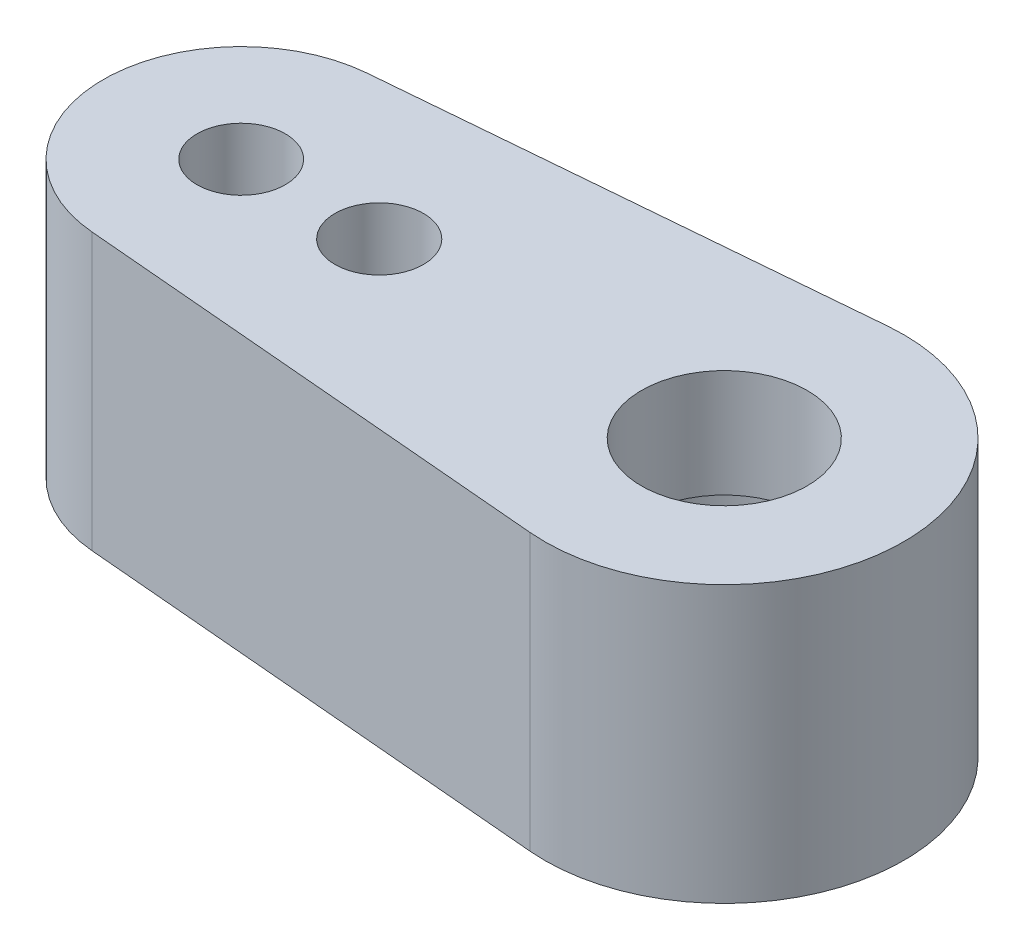
ISO-10303-21;
HEADER;
FILE_DESCRIPTION(('STEP AP214'),'2;1');
FILE_NAME('part.step','',(''),(''),'','','');
FILE_SCHEMA(('AUTOMOTIVE_DESIGN { 1 0 10303 214 1 1 1 1 }'));
ENDSEC;
DATA;
#1=APPLICATION_CONTEXT('core data for automotive mechanical design processes');
#2=APPLICATION_PROTOCOL_DEFINITION('international standard','automotive_design',2000,#1);
#3=PRODUCT_CONTEXT('',#1,'mechanical');
#4=PRODUCT('Part','Part','',(#3));
#5=PRODUCT_RELATED_PRODUCT_CATEGORY('part','',(#4));
#6=PRODUCT_DEFINITION_FORMATION('','',#4);
#7=PRODUCT_DEFINITION_CONTEXT('part definition',#1,'design');
#8=PRODUCT_DEFINITION('design','',#6,#7);
#9=PRODUCT_DEFINITION_SHAPE('','',#8);
#10=(LENGTH_UNIT() NAMED_UNIT(*) SI_UNIT(.MILLI.,.METRE.));
#11=(NAMED_UNIT(*) PLANE_ANGLE_UNIT() SI_UNIT($,.RADIAN.));
#12=(NAMED_UNIT(*) SI_UNIT($,.STERADIAN.) SOLID_ANGLE_UNIT());
#13=UNCERTAINTY_MEASURE_WITH_UNIT(LENGTH_MEASURE(1.E-05),#10,'distance_accuracy_value','');
#14=(GEOMETRIC_REPRESENTATION_CONTEXT(3) GLOBAL_UNCERTAINTY_ASSIGNED_CONTEXT((#13)) GLOBAL_UNIT_ASSIGNED_CONTEXT((#10,
#11,#12)) REPRESENTATION_CONTEXT('',''));
#15=CARTESIAN_POINT('',(0.,0.,0.));
#16=DIRECTION('',(0.,0.,1.));
#17=DIRECTION('',(1.,0.,0.));
#18=AXIS2_PLACEMENT_3D('',#15,#16,#17);
#19=CARTESIAN_POINT('',(-3.5,-1.,0.));
#20=DIRECTION('',(0.,1.,0.));
#21=DIRECTION('',(0.,0.,1.));
#22=AXIS2_PLACEMENT_3D('',#19,#20,#21);
#23=CYLINDRICAL_SURFACE('',#22,1.);
#24=DIRECTION('',(0.,1.,0.));
#25=VECTOR('',#24,1.);
#26=CARTESIAN_POINT('',(-3.58571428571429,-1.,0.996319758523583));
#27=LINE('',#26,#25);
#28=CARTESIAN_POINT('',(-3.58571428571429,-1.,0.996319758523583));
#29=VERTEX_POINT('',#28);
#30=CARTESIAN_POINT('',(-3.58571428571429,1.,0.996319758523583));
#31=VERTEX_POINT('',#30);
#32=EDGE_CURVE('E35',#29,#31,#27,.T.);
#33=ORIENTED_EDGE('',*,*,#32,.T.);
#34=CARTESIAN_POINT('',(-3.5,1.,0.));
#35=DIRECTION('',(0.,1.,0.));
#36=DIRECTION('',(0.,0.,-1.));
#37=AXIS2_PLACEMENT_3D('',#34,#35,#36);
#38=CIRCLE('',#37,1.);
#39=CARTESIAN_POINT('',(-3.58571428571429,1.,-0.996319758523583));
#40=VERTEX_POINT('',#39);
#41=EDGE_CURVE('E72',#40,#31,#38,.T.);
#42=ORIENTED_EDGE('',*,*,#41,.F.);
#43=DIRECTION('',(0.,1.,0.));
#44=VECTOR('',#43,1.);
#45=CARTESIAN_POINT('',(-3.58571428571429,-1.,-0.996319758523583));
#46=LINE('',#45,#44);
#47=CARTESIAN_POINT('',(-3.58571428571429,-1.,-0.996319758523583));
#48=VERTEX_POINT('',#47);
#49=EDGE_CURVE('E11',#48,#40,#46,.T.);
#50=ORIENTED_EDGE('',*,*,#49,.F.);
#51=CARTESIAN_POINT('',(-3.5,-1.,0.));
#52=DIRECTION('',(0.,1.,0.));
#53=DIRECTION('',(0.,0.,-1.));
#54=AXIS2_PLACEMENT_3D('',#51,#52,#53);
#55=CIRCLE('',#54,1.);
#56=EDGE_CURVE('E73',#48,#29,#55,.T.);
#57=ORIENTED_EDGE('',*,*,#56,.T.);
#58=EDGE_LOOP('',(#33,#42,#50,#57));
#59=FACE_BOUND('',#58,.T.);
#60=ADVANCED_FACE('F32',(#59),#23,.T.);
#61=CARTESIAN_POINT('',(-3.58571428571429,-1.,-0.996319758523583));
#62=DIRECTION('',(-0.0857142857142858,0.,-0.996319758523583));
#63=DIRECTION('',(-0.996319758523583,0.,0.0857142857142858));
#64=AXIS2_PLACEMENT_3D('',#61,#62,#63);
#65=PLANE('',#64);
#66=ORIENTED_EDGE('',*,*,#49,.T.);
#67=DIRECTION('',(-0.996319758523582,0.,0.0857142857142858));
#68=VECTOR('',#67,1.);
#69=CARTESIAN_POINT('',(-3.58571428571429,1.,-0.996319758523583));
#70=LINE('',#69,#68);
#71=CARTESIAN_POINT('',(-0.111428571428571,1.,-1.29521568608066));
#72=VERTEX_POINT('',#71);
#73=EDGE_CURVE('E89',#72,#40,#70,.T.);
#74=ORIENTED_EDGE('',*,*,#73,.F.);
#75=DIRECTION('',(0.,1.,0.));
#76=VECTOR('',#75,1.);
#77=CARTESIAN_POINT('',(-0.111428571428571,-1.,-1.29521568608066));
#78=LINE('',#77,#76);
#79=CARTESIAN_POINT('',(-0.111428571428571,-1.,-1.29521568608066));
#80=VERTEX_POINT('',#79);
#81=EDGE_CURVE('E40',#80,#72,#78,.T.);
#82=ORIENTED_EDGE('',*,*,#81,.F.);
#83=DIRECTION('',(-0.996319758523582,0.,0.0857142857142858));
#84=VECTOR('',#83,1.);
#85=CARTESIAN_POINT('',(-3.58571428571429,-1.,-0.996319758523583));
#86=LINE('',#85,#84);
#87=EDGE_CURVE('E78',#80,#48,#86,.T.);
#88=ORIENTED_EDGE('',*,*,#87,.T.);
#89=EDGE_LOOP('',(#66,#74,#82,#88));
#90=FACE_BOUND('',#89,.T.);
#91=ADVANCED_FACE('F109',(#90),#65,.T.);
#92=CARTESIAN_POINT('',(0.,-1.,0.));
#93=DIRECTION('',(0.,1.,0.));
#94=DIRECTION('',(0.,0.,1.));
#95=AXIS2_PLACEMENT_3D('',#92,#93,#94);
#96=CYLINDRICAL_SURFACE('',#95,1.3);
#97=ORIENTED_EDGE('',*,*,#81,.T.);
#98=CARTESIAN_POINT('',(0.,1.,0.));
#99=DIRECTION('',(0.,1.,0.));
#100=DIRECTION('',(0.,0.,1.));
#101=AXIS2_PLACEMENT_3D('',#98,#99,#100);
#102=CIRCLE('',#101,1.3);
#103=CARTESIAN_POINT('',(-0.111428571428571,1.,1.29521568608066));
#104=VERTEX_POINT('',#103);
#105=EDGE_CURVE('E85',#104,#72,#102,.T.);
#106=ORIENTED_EDGE('',*,*,#105,.F.);
#107=DIRECTION('',(0.,1.,0.));
#108=VECTOR('',#107,1.);
#109=CARTESIAN_POINT('',(-0.111428571428571,-1.,1.29521568608066));
#110=LINE('',#109,#108);
#111=CARTESIAN_POINT('',(-0.111428571428571,-1.,1.29521568608066));
#112=VERTEX_POINT('',#111);
#113=EDGE_CURVE('E77',#112,#104,#110,.T.);
#114=ORIENTED_EDGE('',*,*,#113,.F.);
#115=CARTESIAN_POINT('',(0.,-1.,0.));
#116=DIRECTION('',(0.,1.,0.));
#117=DIRECTION('',(0.,0.,1.));
#118=AXIS2_PLACEMENT_3D('',#115,#116,#117);
#119=CIRCLE('',#118,1.3);
#120=EDGE_CURVE('E102',#112,#80,#119,.T.);
#121=ORIENTED_EDGE('',*,*,#120,.T.);
#122=EDGE_LOOP('',(#97,#106,#114,#121));
#123=FACE_BOUND('',#122,.T.);
#124=ADVANCED_FACE('F106',(#123),#96,.T.);
#125=CARTESIAN_POINT('',(-3.58571428571429,-1.,0.996319758523583));
#126=DIRECTION('',(-0.0857142857142857,0.,0.996319758523583));
#127=DIRECTION('',(0.996319758523583,0.,0.0857142857142857));
#128=AXIS2_PLACEMENT_3D('',#125,#126,#127);
#129=PLANE('',#128);
#130=ORIENTED_EDGE('',*,*,#113,.T.);
#131=DIRECTION('',(0.996319758523582,0.,0.0857142857142857));
#132=VECTOR('',#131,1.);
#133=CARTESIAN_POINT('',(-3.58571428571429,1.,0.996319758523583));
#134=LINE('',#133,#132);
#135=EDGE_CURVE('E80',#31,#104,#134,.T.);
#136=ORIENTED_EDGE('',*,*,#135,.F.);
#137=ORIENTED_EDGE('',*,*,#32,.F.);
#138=DIRECTION('',(0.996319758523582,0.,0.0857142857142857));
#139=VECTOR('',#138,1.);
#140=CARTESIAN_POINT('',(-3.58571428571429,-1.,0.996319758523583));
#141=LINE('',#140,#139);
#142=EDGE_CURVE('E100',#29,#112,#141,.T.);
#143=ORIENTED_EDGE('',*,*,#142,.T.);
#144=EDGE_LOOP('',(#130,#136,#137,#143));
#145=FACE_BOUND('',#144,.T.);
#146=ADVANCED_FACE('F81',(#145),#129,.T.);
#147=CARTESIAN_POINT('',(-3.5,-1.,0.));
#148=DIRECTION('',(0.,-1.,0.));
#149=DIRECTION('',(0.,0.,-1.));
#150=AXIS2_PLACEMENT_3D('',#147,#148,#149);
#151=PLANE('',#150);
#152=CARTESIAN_POINT('',(-3.5,-1.,0.));
#153=DIRECTION('',(0.,-1.,0.));
#154=DIRECTION('',(0.,0.,-1.));
#155=AXIS2_PLACEMENT_3D('',#152,#153,#154);
#156=CIRCLE('',#155,0.32);
#157=CARTESIAN_POINT('',(-3.5,-1.,-0.32));
#158=VERTEX_POINT('',#157);
#159=EDGE_CURVE('E225',#158,#158,#156,.F.);
#160=ORIENTED_EDGE('',*,*,#159,.T.);
#161=EDGE_LOOP('',(#160));
#162=FACE_BOUND('',#161,.T.);
#163=CARTESIAN_POINT('',(-2.5,-1.,0.));
#164=DIRECTION('',(0.,-1.,0.));
#165=DIRECTION('',(0.,0.,-1.));
#166=AXIS2_PLACEMENT_3D('',#163,#164,#165);
#167=CIRCLE('',#166,0.3207);
#168=CARTESIAN_POINT('',(-2.5,-1.,-0.3207));
#169=VERTEX_POINT('',#168);
#170=EDGE_CURVE('E229',#169,#169,#167,.F.);
#171=ORIENTED_EDGE('',*,*,#170,.T.);
#172=EDGE_LOOP('',(#171));
#173=FACE_BOUND('',#172,.T.);
#174=CARTESIAN_POINT('',(0.,-1.,0.));
#175=DIRECTION('',(0.,-1.,0.));
#176=DIRECTION('',(0.,0.,-1.));
#177=AXIS2_PLACEMENT_3D('',#174,#175,#176);
#178=CIRCLE('',#177,0.6);
#179=CARTESIAN_POINT('',(0.,-1.,-0.6));
#180=VERTEX_POINT('',#179);
#181=EDGE_CURVE('E244',#180,#180,#178,.T.);
#182=ORIENTED_EDGE('',*,*,#181,.F.);
#183=EDGE_LOOP('',(#182));
#184=FACE_BOUND('',#183,.T.);
#185=ORIENTED_EDGE('',*,*,#56,.F.);
#186=ORIENTED_EDGE('',*,*,#87,.F.);
#187=ORIENTED_EDGE('',*,*,#120,.F.);
#188=ORIENTED_EDGE('',*,*,#142,.F.);
#189=EDGE_LOOP('',(#185,#186,#187,#188));
#190=FACE_BOUND('',#189,.T.);
#191=ADVANCED_FACE('F111',(#162,#173,#184,#190),#151,.T.);
#192=CARTESIAN_POINT('',(-3.5,1.,0.));
#193=DIRECTION('',(0.,-1.,0.));
#194=DIRECTION('',(0.,0.,-1.));
#195=AXIS2_PLACEMENT_3D('',#192,#193,#194);
#196=PLANE('',#195);
#197=CARTESIAN_POINT('',(-3.5,1.,0.));
#198=DIRECTION('',(0.,1.,0.));
#199=DIRECTION('',(0.,0.,1.));
#200=AXIS2_PLACEMENT_3D('',#197,#198,#199);
#201=CIRCLE('',#200,0.32);
#202=CARTESIAN_POINT('',(-3.5,1.,0.32));
#203=VERTEX_POINT('',#202);
#204=EDGE_CURVE('E228',#203,#203,#201,.T.);
#205=ORIENTED_EDGE('',*,*,#204,.F.);
#206=EDGE_LOOP('',(#205));
#207=FACE_BOUND('',#206,.T.);
#208=CARTESIAN_POINT('',(-2.5,1.,0.));
#209=DIRECTION('',(0.,1.,0.));
#210=DIRECTION('',(0.,0.,1.));
#211=AXIS2_PLACEMENT_3D('',#208,#209,#210);
#212=CIRCLE('',#211,0.3207);
#213=CARTESIAN_POINT('',(-2.5,1.,0.3207));
#214=VERTEX_POINT('',#213);
#215=EDGE_CURVE('E232',#214,#214,#212,.T.);
#216=ORIENTED_EDGE('',*,*,#215,.F.);
#217=EDGE_LOOP('',(#216));
#218=FACE_BOUND('',#217,.T.);
#219=CARTESIAN_POINT('',(0.,1.,0.));
#220=DIRECTION('',(0.,-1.,0.));
#221=DIRECTION('',(0.,0.,-1.));
#222=AXIS2_PLACEMENT_3D('',#219,#220,#221);
#223=CIRCLE('',#222,0.6);
#224=CARTESIAN_POINT('',(0.,1.,-0.6));
#225=VERTEX_POINT('',#224);
#226=EDGE_CURVE('E247',#225,#225,#223,.T.);
#227=ORIENTED_EDGE('',*,*,#226,.T.);
#228=EDGE_LOOP('',(#227));
#229=FACE_BOUND('',#228,.T.);
#230=ORIENTED_EDGE('',*,*,#41,.T.);
#231=ORIENTED_EDGE('',*,*,#135,.T.);
#232=ORIENTED_EDGE('',*,*,#105,.T.);
#233=ORIENTED_EDGE('',*,*,#73,.T.);
#234=EDGE_LOOP('',(#230,#231,#232,#233));
#235=FACE_BOUND('',#234,.T.);
#236=ADVANCED_FACE('F88',(#207,#218,#229,#235),#196,.F.);
#237=CARTESIAN_POINT('',(0.,-1.,0.));
#238=DIRECTION('',(0.,-1.,0.));
#239=DIRECTION('',(0.,0.,-1.));
#240=AXIS2_PLACEMENT_3D('',#237,#238,#239);
#241=CYLINDRICAL_SURFACE('',#240,0.85);
#242=CARTESIAN_POINT('',(0.,0.075,0.));
#243=DIRECTION('',(0.,-1.,0.));
#244=DIRECTION('',(0.,0.,-1.));
#245=AXIS2_PLACEMENT_3D('',#242,#243,#244);
#246=CIRCLE('',#245,0.85);
#247=CARTESIAN_POINT('',(0.,0.075,-0.85));
#248=VERTEX_POINT('',#247);
#249=EDGE_CURVE('E90',#248,#248,#246,.T.);
#250=ORIENTED_EDGE('',*,*,#249,.F.);
#251=EDGE_LOOP('',(#250));
#252=FACE_BOUND('',#251,.T.);
#253=CARTESIAN_POINT('',(0.,-0.075,0.));
#254=DIRECTION('',(0.,-1.,0.));
#255=DIRECTION('',(0.,0.,-1.));
#256=AXIS2_PLACEMENT_3D('',#253,#254,#255);
#257=CIRCLE('',#256,0.85);
#258=CARTESIAN_POINT('',(0.,-0.075,-0.85));
#259=VERTEX_POINT('',#258);
#260=EDGE_CURVE('E237',#259,#259,#257,.T.);
#261=ORIENTED_EDGE('',*,*,#260,.T.);
#262=EDGE_LOOP('',(#261));
#263=FACE_BOUND('',#262,.T.);
#264=ADVANCED_FACE('F119',(#252,#263),#241,.F.);
#265=CARTESIAN_POINT('',(0.,0.075,0.));
#266=DIRECTION('',(0.,-1.,0.));
#267=DIRECTION('',(0.,0.,-1.));
#268=AXIS2_PLACEMENT_3D('',#265,#266,#267);
#269=CONICAL_SURFACE('',#268,0.85,1.0471975511966);
#270=CARTESIAN_POINT('',(0.,0.219337567297406,0.));
#271=DIRECTION('',(0.,-1.,0.));
#272=DIRECTION('',(0.,0.,-1.));
#273=AXIS2_PLACEMENT_3D('',#270,#271,#272);
#274=CIRCLE('',#273,0.6);
#275=CARTESIAN_POINT('',(0.,0.219337567297406,-0.6));
#276=VERTEX_POINT('',#275);
#277=EDGE_CURVE('E93',#276,#276,#274,.T.);
#278=ORIENTED_EDGE('',*,*,#277,.F.);
#279=EDGE_LOOP('',(#278));
#280=FACE_BOUND('',#279,.T.);
#281=ORIENTED_EDGE('',*,*,#249,.T.);
#282=EDGE_LOOP('',(#281));
#283=FACE_BOUND('',#282,.T.);
#284=ADVANCED_FACE('F149',(#280,#283),#269,.F.);
#285=CARTESIAN_POINT('',(0.,-1.,0.));
#286=DIRECTION('',(0.,-1.,0.));
#287=DIRECTION('',(0.,0.,-1.));
#288=AXIS2_PLACEMENT_3D('',#285,#286,#287);
#289=CYLINDRICAL_SURFACE('',#288,0.6);
#290=ORIENTED_EDGE('',*,*,#226,.F.);
#291=EDGE_LOOP('',(#290));
#292=FACE_BOUND('',#291,.T.);
#293=ORIENTED_EDGE('',*,*,#277,.T.);
#294=EDGE_LOOP('',(#293));
#295=FACE_BOUND('',#294,.T.);
#296=ADVANCED_FACE('F160',(#292,#295),#289,.F.);
#297=CARTESIAN_POINT('',(0.,-1.,0.));
#298=DIRECTION('',(0.,-1.,0.));
#299=DIRECTION('',(0.,0.,-1.));
#300=AXIS2_PLACEMENT_3D('',#297,#298,#299);
#301=CYLINDRICAL_SURFACE('',#300,0.6);
#302=CARTESIAN_POINT('',(0.,-0.219337567297406,0.));
#303=DIRECTION('',(0.,-1.,0.));
#304=DIRECTION('',(0.,0.,-1.));
#305=AXIS2_PLACEMENT_3D('',#302,#303,#304);
#306=CIRCLE('',#305,0.6);
#307=CARTESIAN_POINT('',(0.,-0.219337567297406,-0.6));
#308=VERTEX_POINT('',#307);
#309=EDGE_CURVE('E241',#308,#308,#306,.T.);
#310=ORIENTED_EDGE('',*,*,#309,.F.);
#311=EDGE_LOOP('',(#310));
#312=FACE_BOUND('',#311,.T.);
#313=ORIENTED_EDGE('',*,*,#181,.T.);
#314=EDGE_LOOP('',(#313));
#315=FACE_BOUND('',#314,.T.);
#316=ADVANCED_FACE('F170',(#312,#315),#301,.F.);
#317=CARTESIAN_POINT('',(0.,-0.219337567297406,0.));
#318=DIRECTION('',(0.,1.,0.));
#319=DIRECTION('',(0.,0.,1.));
#320=AXIS2_PLACEMENT_3D('',#317,#318,#319);
#321=CONICAL_SURFACE('',#320,0.6,1.0471975511966);
#322=ORIENTED_EDGE('',*,*,#260,.F.);
#323=EDGE_LOOP('',(#322));
#324=FACE_BOUND('',#323,.T.);
#325=ORIENTED_EDGE('',*,*,#309,.T.);
#326=EDGE_LOOP('',(#325));
#327=FACE_BOUND('',#326,.T.);
#328=ADVANCED_FACE('F180',(#324,#327),#321,.F.);
#329=CARTESIAN_POINT('',(-2.5,-1.001,0.));
#330=DIRECTION('',(0.,1.,0.));
#331=DIRECTION('',(0.,0.,1.));
#332=AXIS2_PLACEMENT_3D('',#329,#330,#331);
#333=CYLINDRICAL_SURFACE('',#332,0.3207);
#334=ORIENTED_EDGE('',*,*,#170,.F.);
#335=EDGE_LOOP('',(#334));
#336=FACE_BOUND('',#335,.T.);
#337=ORIENTED_EDGE('',*,*,#215,.T.);
#338=EDGE_LOOP('',(#337));
#339=FACE_BOUND('',#338,.T.);
#340=ADVANCED_FACE('F189',(#336,#339),#333,.F.);
#341=CARTESIAN_POINT('',(-3.5,-1.001,0.));
#342=DIRECTION('',(0.,1.,0.));
#343=DIRECTION('',(0.,0.,1.));
#344=AXIS2_PLACEMENT_3D('',#341,#342,#343);
#345=CYLINDRICAL_SURFACE('',#344,0.32);
#346=ORIENTED_EDGE('',*,*,#159,.F.);
#347=EDGE_LOOP('',(#346));
#348=FACE_BOUND('',#347,.T.);
#349=ORIENTED_EDGE('',*,*,#204,.T.);
#350=EDGE_LOOP('',(#349));
#351=FACE_BOUND('',#350,.T.);
#352=ADVANCED_FACE('F209',(#348,#351),#345,.F.);
#353=CLOSED_SHELL('',(#60,#91,#124,#146,#191,#236,#264,#284,#296,#316,#328,#340,#352));
#354=MANIFOLD_SOLID_BREP('B2',#353);
#355=ADVANCED_BREP_SHAPE_REPRESENTATION('',(#18,#354),#14);
#356=SHAPE_DEFINITION_REPRESENTATION(#9,#355);
ENDSEC;
END-ISO-10303-21;
